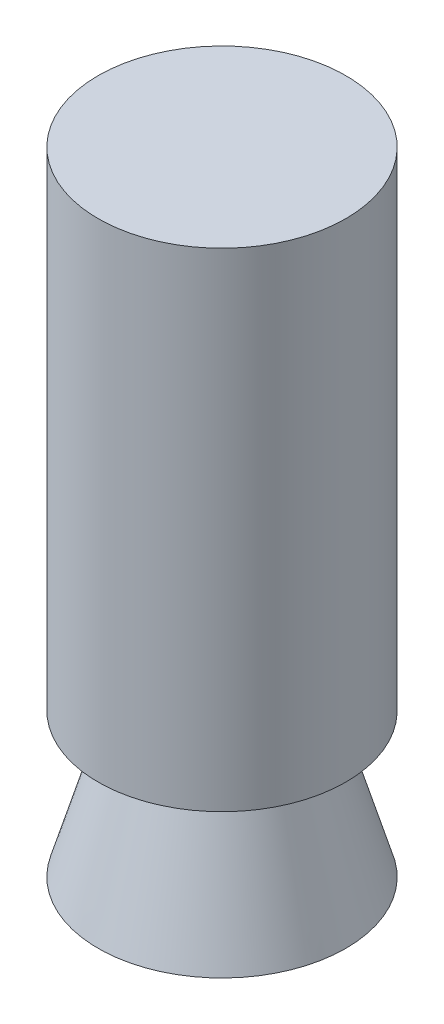
ISO-10303-21;
HEADER;
FILE_DESCRIPTION(('STEP AP214'),'2;1');
FILE_NAME('part.step','',(''),(''),'','','');
FILE_SCHEMA(('AUTOMOTIVE_DESIGN { 1 0 10303 214 1 1 1 1 }'));
ENDSEC;
DATA;
#1=APPLICATION_CONTEXT('core data for automotive mechanical design processes');
#2=APPLICATION_PROTOCOL_DEFINITION('international standard','automotive_design',2000,#1);
#3=PRODUCT_CONTEXT('',#1,'mechanical');
#4=PRODUCT('Part','Part','',(#3));
#5=PRODUCT_RELATED_PRODUCT_CATEGORY('part','',(#4));
#6=PRODUCT_DEFINITION_FORMATION('','',#4);
#7=PRODUCT_DEFINITION_CONTEXT('part definition',#1,'design');
#8=PRODUCT_DEFINITION('design','',#6,#7);
#9=PRODUCT_DEFINITION_SHAPE('','',#8);
#10=(LENGTH_UNIT() NAMED_UNIT(*) SI_UNIT(.MILLI.,.METRE.));
#11=(NAMED_UNIT(*) PLANE_ANGLE_UNIT() SI_UNIT($,.RADIAN.));
#12=(NAMED_UNIT(*) SI_UNIT($,.STERADIAN.) SOLID_ANGLE_UNIT());
#13=UNCERTAINTY_MEASURE_WITH_UNIT(LENGTH_MEASURE(1.E-05),#10,'distance_accuracy_value','');
#14=(GEOMETRIC_REPRESENTATION_CONTEXT(3) GLOBAL_UNCERTAINTY_ASSIGNED_CONTEXT((#13)) GLOBAL_UNIT_ASSIGNED_CONTEXT((#10,
#11,#12)) REPRESENTATION_CONTEXT('',''));
#15=CARTESIAN_POINT('',(0.,0.,0.));
#16=DIRECTION('',(0.,0.,1.));
#17=DIRECTION('',(1.,0.,0.));
#18=AXIS2_PLACEMENT_3D('',#15,#16,#17);
#19=CARTESIAN_POINT('',(-6.63246602956234,74.8573463984349,0.));
#20=DIRECTION('',(0.,-1.,0.));
#21=DIRECTION('',(1.,0.,0.));
#22=AXIS2_PLACEMENT_3D('',#19,#20,#21);
#23=PLANE('',#22);
#24=CARTESIAN_POINT('',(-6.63246602956234,74.8573463984349,0.));
#25=DIRECTION('',(0.,1.,0.));
#26=DIRECTION('',(-1.,0.,0.));
#27=AXIS2_PLACEMENT_3D('',#24,#25,#26);
#28=CIRCLE('',#27,39.);
#29=CARTESIAN_POINT('',(-45.6324660295623,74.8573463984349,0.));
#30=VERTEX_POINT('',#29);
#31=EDGE_CURVE('E10',#30,#30,#28,.T.);
#32=ORIENTED_EDGE('',*,*,#31,.F.);
#33=EDGE_LOOP('',(#32));
#34=FACE_BOUND('',#33,.T.);
#35=ADVANCED_FACE('F37',(#34),#23,.T.);
#36=CARTESIAN_POINT('',(-6.63246602956234,84.8573463984349,0.));
#37=DIRECTION('',(0.,1.,0.));
#38=DIRECTION('',(-1.,0.,0.));
#39=AXIS2_PLACEMENT_3D('',#36,#37,#38);
#40=CYLINDRICAL_SURFACE('',#39,39.);
#41=ORIENTED_EDGE('',*,*,#31,.T.);
#42=EDGE_LOOP('',(#41));
#43=FACE_BOUND('',#42,.T.);
#44=CARTESIAN_POINT('',(-6.63246602956232,-98.1792991312992,0.));
#45=DIRECTION('',(0.,1.,0.));
#46=DIRECTION('',(-1.,0.,0.));
#47=AXIS2_PLACEMENT_3D('',#44,#45,#46);
#48=CIRCLE('',#47,39.);
#49=CARTESIAN_POINT('',(-45.6324660295623,-98.1792991312992,0.));
#50=VERTEX_POINT('',#49);
#51=EDGE_CURVE('E44',#50,#50,#48,.T.);
#52=ORIENTED_EDGE('',*,*,#51,.F.);
#53=EDGE_LOOP('',(#52));
#54=FACE_BOUND('',#53,.T.);
#55=ADVANCED_FACE('F93',(#43,#54),#40,.F.);
#56=CARTESIAN_POINT('',(-45.6324660295623,-98.1792991312992,0.));
#57=DIRECTION('',(0.,1.,0.));
#58=DIRECTION('',(-1.,0.,0.));
#59=AXIS2_PLACEMENT_3D('',#56,#57,#58);
#60=PLANE('',#59);
#61=ORIENTED_EDGE('',*,*,#51,.T.);
#62=EDGE_LOOP('',(#61));
#63=FACE_BOUND('',#62,.T.);
#64=CARTESIAN_POINT('',(-6.63246602956232,-98.1792991312992,0.));
#65=DIRECTION('',(0.,1.,0.));
#66=DIRECTION('',(-1.,0.,0.));
#67=AXIS2_PLACEMENT_3D('',#64,#65,#66);
#68=CIRCLE('',#67,18.8140405719488);
#69=CARTESIAN_POINT('',(-25.4465066015111,-98.1792991312992,0.));
#70=VERTEX_POINT('',#69);
#71=EDGE_CURVE('E49',#70,#70,#68,.T.);
#72=ORIENTED_EDGE('',*,*,#71,.F.);
#73=EDGE_LOOP('',(#72));
#74=FACE_BOUND('',#73,.T.);
#75=ADVANCED_FACE('F98',(#63,#74),#60,.T.);
#76=CARTESIAN_POINT('',(-6.63246602956231,-165.142653601565,0.));
#77=DIRECTION('',(0.,-1.,0.));
#78=DIRECTION('',(1.,0.,0.));
#79=AXIS2_PLACEMENT_3D('',#76,#77,#78);
#80=CONICAL_SURFACE('',#79,38.5737189402243,0.286938752930776);
#81=ORIENTED_EDGE('',*,*,#71,.T.);
#82=EDGE_LOOP('',(#81));
#83=FACE_BOUND('',#82,.T.);
#84=CARTESIAN_POINT('',(-6.63246602956231,-165.142653601565,0.));
#85=DIRECTION('',(0.,1.,0.));
#86=DIRECTION('',(-1.,0.,0.));
#87=AXIS2_PLACEMENT_3D('',#84,#85,#86);
#88=CIRCLE('',#87,38.5737189402243);
#89=CARTESIAN_POINT('',(-45.2061849697867,-165.142653601565,0.));
#90=VERTEX_POINT('',#89);
#91=EDGE_CURVE('E54',#90,#90,#88,.T.);
#92=ORIENTED_EDGE('',*,*,#91,.F.);
#93=EDGE_LOOP('',(#92));
#94=FACE_BOUND('',#93,.T.);
#95=ADVANCED_FACE('F102',(#83,#94),#80,.F.);
#96=CARTESIAN_POINT('',(-55.6324660295623,-165.142653601565,0.));
#97=DIRECTION('',(0.,-1.,0.));
#98=DIRECTION('',(1.,0.,0.));
#99=AXIS2_PLACEMENT_3D('',#96,#97,#98);
#100=PLANE('',#99);
#101=ORIENTED_EDGE('',*,*,#91,.T.);
#102=EDGE_LOOP('',(#101));
#103=FACE_BOUND('',#102,.T.);
#104=CARTESIAN_POINT('',(-6.63246602956231,-165.142653601565,0.));
#105=DIRECTION('',(0.,1.,0.));
#106=DIRECTION('',(-1.,0.,0.));
#107=AXIS2_PLACEMENT_3D('',#104,#105,#106);
#108=CIRCLE('',#107,49.);
#109=CARTESIAN_POINT('',(-55.6324660295623,-165.142653601565,0.));
#110=VERTEX_POINT('',#109);
#111=EDGE_CURVE('E60',#110,#110,#108,.T.);
#112=ORIENTED_EDGE('',*,*,#111,.F.);
#113=EDGE_LOOP('',(#112));
#114=FACE_BOUND('',#113,.T.);
#115=ADVANCED_FACE('F108',(#103,#114),#100,.T.);
#116=CARTESIAN_POINT('',(-6.63246602956232,-108.179299131299,0.));
#117=DIRECTION('',(0.,-1.,0.));
#118=DIRECTION('',(1.,0.,0.));
#119=AXIS2_PLACEMENT_3D('',#116,#117,#118);
#120=CONICAL_SURFACE('',#119,32.1911413038556,0.286938752930775);
#121=ORIENTED_EDGE('',*,*,#111,.T.);
#122=EDGE_LOOP('',(#121));
#123=FACE_BOUND('',#122,.T.);
#124=CARTESIAN_POINT('',(-6.63246602956232,-108.179299131299,0.));
#125=DIRECTION('',(0.,1.,0.));
#126=DIRECTION('',(-1.,0.,0.));
#127=AXIS2_PLACEMENT_3D('',#124,#125,#126);
#128=CIRCLE('',#127,32.1911413038556);
#129=CARTESIAN_POINT('',(-38.8236073334179,-108.179299131299,0.));
#130=VERTEX_POINT('',#129);
#131=EDGE_CURVE('E64',#130,#130,#128,.T.);
#132=ORIENTED_EDGE('',*,*,#131,.F.);
#133=EDGE_LOOP('',(#132));
#134=FACE_BOUND('',#133,.T.);
#135=ADVANCED_FACE('F89',(#123,#134),#120,.T.);
#136=CARTESIAN_POINT('',(-55.6324660295623,-108.179299131299,0.));
#137=DIRECTION('',(0.,-1.,0.));
#138=DIRECTION('',(1.,0.,0.));
#139=AXIS2_PLACEMENT_3D('',#136,#137,#138);
#140=PLANE('',#139);
#141=ORIENTED_EDGE('',*,*,#131,.T.);
#142=EDGE_LOOP('',(#141));
#143=FACE_BOUND('',#142,.T.);
#144=CARTESIAN_POINT('',(-6.63246602956232,-108.179299131299,0.));
#145=DIRECTION('',(0.,1.,0.));
#146=DIRECTION('',(-1.,0.,0.));
#147=AXIS2_PLACEMENT_3D('',#144,#145,#146);
#148=CIRCLE('',#147,49.);
#149=CARTESIAN_POINT('',(-55.6324660295623,-108.179299131299,0.));
#150=VERTEX_POINT('',#149);
#151=EDGE_CURVE('E68',#150,#150,#148,.T.);
#152=ORIENTED_EDGE('',*,*,#151,.F.);
#153=EDGE_LOOP('',(#152));
#154=FACE_BOUND('',#153,.T.);
#155=ADVANCED_FACE('F81',(#143,#154),#140,.T.);
#156=CARTESIAN_POINT('',(-6.63246602956234,84.8573463984349,0.));
#157=DIRECTION('',(0.,1.,0.));
#158=DIRECTION('',(-1.,0.,0.));
#159=AXIS2_PLACEMENT_3D('',#156,#157,#158);
#160=CYLINDRICAL_SURFACE('',#159,49.);
#161=ORIENTED_EDGE('',*,*,#151,.T.);
#162=EDGE_LOOP('',(#161));
#163=FACE_BOUND('',#162,.T.);
#164=CARTESIAN_POINT('',(-6.63246602956234,84.8573463984349,0.));
#165=DIRECTION('',(0.,1.,0.));
#166=DIRECTION('',(-1.,0.,0.));
#167=AXIS2_PLACEMENT_3D('',#164,#165,#166);
#168=CIRCLE('',#167,49.);
#169=CARTESIAN_POINT('',(-55.6324660295623,84.8573463984349,0.));
#170=VERTEX_POINT('',#169);
#171=EDGE_CURVE('E72',#170,#170,#168,.T.);
#172=ORIENTED_EDGE('',*,*,#171,.F.);
#173=EDGE_LOOP('',(#172));
#174=FACE_BOUND('',#173,.T.);
#175=ADVANCED_FACE('F79',(#163,#174),#160,.T.);
#176=CARTESIAN_POINT('',(-6.63246602956234,84.8573463984349,0.));
#177=DIRECTION('',(0.,1.,0.));
#178=DIRECTION('',(-1.,0.,0.));
#179=AXIS2_PLACEMENT_3D('',#176,#177,#178);
#180=PLANE('',#179);
#181=ORIENTED_EDGE('',*,*,#171,.T.);
#182=EDGE_LOOP('',(#181));
#183=FACE_BOUND('',#182,.T.);
#184=ADVANCED_FACE('F77',(#183),#180,.T.);
#185=CLOSED_SHELL('',(#35,#55,#75,#95,#115,#135,#155,#175,#184));
#186=MANIFOLD_SOLID_BREP('B2',#185);
#187=ADVANCED_BREP_SHAPE_REPRESENTATION('',(#18,#186),#14);
#188=SHAPE_DEFINITION_REPRESENTATION(#9,#187);
ENDSEC;
END-ISO-10303-21;
